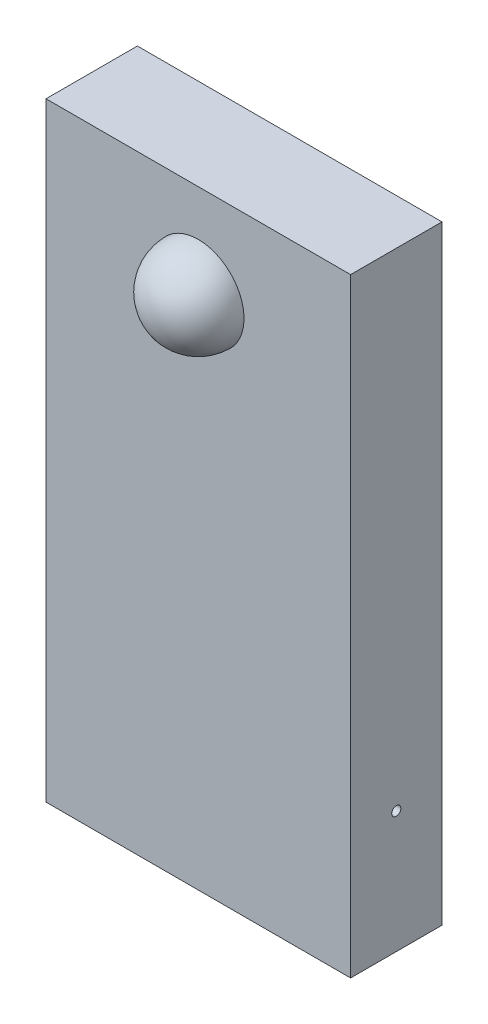
ISO-10303-21;
HEADER;
FILE_DESCRIPTION(('STEP AP214'),'2;1');
FILE_NAME('part.step','',(''),(''),'','','');
FILE_SCHEMA(('AUTOMOTIVE_DESIGN { 1 0 10303 214 1 1 1 1 }'));
ENDSEC;
DATA;
#1=APPLICATION_CONTEXT('core data for automotive mechanical design processes');
#2=APPLICATION_PROTOCOL_DEFINITION('international standard','automotive_design',2000,#1);
#3=PRODUCT_CONTEXT('',#1,'mechanical');
#4=PRODUCT('Part','Part','',(#3));
#5=PRODUCT_RELATED_PRODUCT_CATEGORY('part','',(#4));
#6=PRODUCT_DEFINITION_FORMATION('','',#4);
#7=PRODUCT_DEFINITION_CONTEXT('part definition',#1,'design');
#8=PRODUCT_DEFINITION('design','',#6,#7);
#9=PRODUCT_DEFINITION_SHAPE('','',#8);
#10=(LENGTH_UNIT() NAMED_UNIT(*) SI_UNIT(.MILLI.,.METRE.));
#11=(NAMED_UNIT(*) PLANE_ANGLE_UNIT() SI_UNIT($,.RADIAN.));
#12=(NAMED_UNIT(*) SI_UNIT($,.STERADIAN.) SOLID_ANGLE_UNIT());
#13=UNCERTAINTY_MEASURE_WITH_UNIT(LENGTH_MEASURE(1.E-05),#10,'distance_accuracy_value','');
#14=(GEOMETRIC_REPRESENTATION_CONTEXT(3) GLOBAL_UNCERTAINTY_ASSIGNED_CONTEXT((#13)) GLOBAL_UNIT_ASSIGNED_CONTEXT((#10,
#11,#12)) REPRESENTATION_CONTEXT('',''));
#15=CARTESIAN_POINT('',(0.,0.,0.));
#16=DIRECTION('',(0.,0.,1.));
#17=DIRECTION('',(1.,0.,0.));
#18=AXIS2_PLACEMENT_3D('',#15,#16,#17);
#19=CARTESIAN_POINT('',(50.,200.,15.));
#20=DIRECTION('',(-1.,0.,0.));
#21=DIRECTION('',(0.,0.,1.));
#22=AXIS2_PLACEMENT_3D('',#19,#20,#21);
#23=PLANE('',#22);
#24=CARTESIAN_POINT('',(50.,40.,0.));
#25=DIRECTION('',(-1.,0.,0.));
#26=DIRECTION('',(0.,0.,1.));
#27=AXIS2_PLACEMENT_3D('',#24,#25,#26);
#28=CIRCLE('',#27,1.5);
#29=CARTESIAN_POINT('',(50.,40.,1.5));
#30=VERTEX_POINT('',#29);
#31=EDGE_CURVE('E102',#30,#30,#28,.T.);
#32=ORIENTED_EDGE('',*,*,#31,.T.);
#33=EDGE_LOOP('',(#32));
#34=FACE_BOUND('',#33,.T.);
#35=DIRECTION('',(0.,0.,-1.));
#36=VECTOR('',#35,1.);
#37=CARTESIAN_POINT('',(50.,0.,15.));
#38=LINE('',#37,#36);
#39=CARTESIAN_POINT('',(50.,0.,15.));
#40=VERTEX_POINT('',#39);
#41=CARTESIAN_POINT('',(50.,0.,-15.));
#42=VERTEX_POINT('',#41);
#43=EDGE_CURVE('E99',#40,#42,#38,.T.);
#44=ORIENTED_EDGE('',*,*,#43,.T.);
#45=DIRECTION('',(0.,-1.,0.));
#46=VECTOR('',#45,1.);
#47=CARTESIAN_POINT('',(50.,200.,-15.));
#48=LINE('',#47,#46);
#49=CARTESIAN_POINT('',(50.,200.,-15.));
#50=VERTEX_POINT('',#49);
#51=EDGE_CURVE('E41',#50,#42,#48,.T.);
#52=ORIENTED_EDGE('',*,*,#51,.F.);
#53=DIRECTION('',(0.,0.,-1.));
#54=VECTOR('',#53,1.);
#55=CARTESIAN_POINT('',(50.,200.,15.));
#56=LINE('',#55,#54);
#57=CARTESIAN_POINT('',(50.,200.,15.));
#58=VERTEX_POINT('',#57);
#59=EDGE_CURVE('E85',#58,#50,#56,.T.);
#60=ORIENTED_EDGE('',*,*,#59,.F.);
#61=DIRECTION('',(0.,-1.,0.));
#62=VECTOR('',#61,1.);
#63=CARTESIAN_POINT('',(50.,200.,15.));
#64=LINE('',#63,#62);
#65=EDGE_CURVE('E95',#58,#40,#64,.T.);
#66=ORIENTED_EDGE('',*,*,#65,.T.);
#67=EDGE_LOOP('',(#44,#52,#60,#66));
#68=FACE_BOUND('',#67,.T.);
#69=ADVANCED_FACE('F33',(#34,#68),#23,.F.);
#70=CARTESIAN_POINT('',(-50.,200.,-15.));
#71=DIRECTION('',(0.,0.,1.));
#72=DIRECTION('',(1.,0.,0.));
#73=AXIS2_PLACEMENT_3D('',#70,#71,#72);
#74=PLANE('',#73);
#75=DIRECTION('',(-1.,0.,0.));
#76=VECTOR('',#75,1.);
#77=CARTESIAN_POINT('',(-50.,0.,-15.));
#78=LINE('',#77,#76);
#79=CARTESIAN_POINT('',(-50.,0.,-15.));
#80=VERTEX_POINT('',#79);
#81=EDGE_CURVE('E90',#42,#80,#78,.T.);
#82=ORIENTED_EDGE('',*,*,#81,.T.);
#83=DIRECTION('',(0.,-1.,0.));
#84=VECTOR('',#83,1.);
#85=CARTESIAN_POINT('',(-50.,200.,-15.));
#86=LINE('',#85,#84);
#87=CARTESIAN_POINT('',(-50.,200.,-15.));
#88=VERTEX_POINT('',#87);
#89=EDGE_CURVE('E88',#88,#80,#86,.T.);
#90=ORIENTED_EDGE('',*,*,#89,.F.);
#91=DIRECTION('',(-1.,0.,0.));
#92=VECTOR('',#91,1.);
#93=CARTESIAN_POINT('',(-50.,200.,-15.));
#94=LINE('',#93,#92);
#95=EDGE_CURVE('E80',#50,#88,#94,.T.);
#96=ORIENTED_EDGE('',*,*,#95,.F.);
#97=ORIENTED_EDGE('',*,*,#51,.T.);
#98=EDGE_LOOP('',(#82,#90,#96,#97));
#99=FACE_BOUND('',#98,.T.);
#100=ADVANCED_FACE('F89',(#99),#74,.F.);
#101=CARTESIAN_POINT('',(-50.,200.,15.));
#102=DIRECTION('',(1.,0.,0.));
#103=DIRECTION('',(0.,0.,-1.));
#104=AXIS2_PLACEMENT_3D('',#101,#102,#103);
#105=PLANE('',#104);
#106=CARTESIAN_POINT('',(-50.,40.,0.));
#107=DIRECTION('',(-1.,0.,0.));
#108=DIRECTION('',(0.,0.,1.));
#109=AXIS2_PLACEMENT_3D('',#106,#107,#108);
#110=CIRCLE('',#109,1.5);
#111=CARTESIAN_POINT('',(-50.,40.,1.5));
#112=VERTEX_POINT('',#111);
#113=EDGE_CURVE('E134',#112,#112,#110,.T.);
#114=ORIENTED_EDGE('',*,*,#113,.F.);
#115=EDGE_LOOP('',(#114));
#116=FACE_BOUND('',#115,.T.);
#117=DIRECTION('',(0.,0.,1.));
#118=VECTOR('',#117,1.);
#119=CARTESIAN_POINT('',(-50.,0.,15.));
#120=LINE('',#119,#118);
#121=CARTESIAN_POINT('',(-50.,0.,15.));
#122=VERTEX_POINT('',#121);
#123=EDGE_CURVE('E66',#80,#122,#120,.T.);
#124=ORIENTED_EDGE('',*,*,#123,.T.);
#125=DIRECTION('',(0.,-1.,0.));
#126=VECTOR('',#125,1.);
#127=CARTESIAN_POINT('',(-50.,200.,15.));
#128=LINE('',#127,#126);
#129=CARTESIAN_POINT('',(-50.,200.,15.));
#130=VERTEX_POINT('',#129);
#131=EDGE_CURVE('E91',#130,#122,#128,.T.);
#132=ORIENTED_EDGE('',*,*,#131,.F.);
#133=DIRECTION('',(0.,0.,1.));
#134=VECTOR('',#133,1.);
#135=CARTESIAN_POINT('',(-50.,200.,15.));
#136=LINE('',#135,#134);
#137=EDGE_CURVE('E83',#88,#130,#136,.T.);
#138=ORIENTED_EDGE('',*,*,#137,.F.);
#139=ORIENTED_EDGE('',*,*,#89,.T.);
#140=EDGE_LOOP('',(#124,#132,#138,#139));
#141=FACE_BOUND('',#140,.T.);
#142=ADVANCED_FACE('F93',(#116,#141),#105,.F.);
#143=CARTESIAN_POINT('',(-50.,200.,15.));
#144=DIRECTION('',(0.,0.,-1.));
#145=DIRECTION('',(-1.,0.,0.));
#146=AXIS2_PLACEMENT_3D('',#143,#144,#145);
#147=PLANE('',#146);
#148=CARTESIAN_POINT('',(0.,170.,15.));
#149=DIRECTION('',(0.,0.,-1.));
#150=DIRECTION('',(-1.,0.,0.));
#151=AXIS2_PLACEMENT_3D('',#148,#149,#150);
#152=CIRCLE('',#151,15.);
#153=CARTESIAN_POINT('',(-15.,170.,15.));
#154=VERTEX_POINT('',#153);
#155=EDGE_CURVE('E11',#154,#154,#152,.F.);
#156=ORIENTED_EDGE('',*,*,#155,.F.);
#157=EDGE_LOOP('',(#156));
#158=FACE_BOUND('',#157,.T.);
#159=DIRECTION('',(1.,0.,0.));
#160=VECTOR('',#159,1.);
#161=CARTESIAN_POINT('',(-50.,0.,15.));
#162=LINE('',#161,#160);
#163=EDGE_CURVE('E72',#122,#40,#162,.T.);
#164=ORIENTED_EDGE('',*,*,#163,.T.);
#165=ORIENTED_EDGE('',*,*,#65,.F.);
#166=DIRECTION('',(1.,0.,0.));
#167=VECTOR('',#166,1.);
#168=CARTESIAN_POINT('',(-50.,200.,15.));
#169=LINE('',#168,#167);
#170=EDGE_CURVE('E49',#130,#58,#169,.T.);
#171=ORIENTED_EDGE('',*,*,#170,.F.);
#172=ORIENTED_EDGE('',*,*,#131,.T.);
#173=EDGE_LOOP('',(#164,#165,#171,#172));
#174=FACE_BOUND('',#173,.T.);
#175=ADVANCED_FACE('F121',(#158,#174),#147,.F.);
#176=CARTESIAN_POINT('',(0.,200.,0.));
#177=DIRECTION('',(0.,-1.,0.));
#178=DIRECTION('',(0.,0.,-1.));
#179=AXIS2_PLACEMENT_3D('',#176,#177,#178);
#180=PLANE('',#179);
#181=ORIENTED_EDGE('',*,*,#59,.T.);
#182=ORIENTED_EDGE('',*,*,#95,.T.);
#183=ORIENTED_EDGE('',*,*,#137,.T.);
#184=ORIENTED_EDGE('',*,*,#170,.T.);
#185=EDGE_LOOP('',(#181,#182,#183,#184));
#186=FACE_BOUND('',#185,.T.);
#187=ADVANCED_FACE('F81',(#186),#180,.F.);
#188=CARTESIAN_POINT('',(0.,0.,0.));
#189=DIRECTION('',(0.,-1.,0.));
#190=DIRECTION('',(0.,0.,-1.));
#191=AXIS2_PLACEMENT_3D('',#188,#189,#190);
#192=PLANE('',#191);
#193=ORIENTED_EDGE('',*,*,#43,.F.);
#194=ORIENTED_EDGE('',*,*,#163,.F.);
#195=ORIENTED_EDGE('',*,*,#123,.F.);
#196=ORIENTED_EDGE('',*,*,#81,.F.);
#197=EDGE_LOOP('',(#193,#194,#195,#196));
#198=FACE_BOUND('',#197,.T.);
#199=ADVANCED_FACE('F110',(#198),#192,.T.);
#200=CARTESIAN_POINT('',(0.,170.,15.));
#201=DIRECTION('',(-1.,0.,0.));
#202=DIRECTION('',(0.,1.,0.));
#203=AXIS2_PLACEMENT_3D('',#200,#201,#202);
#204=SPHERICAL_SURFACE('',#203,15.);
#205=CARTESIAN_POINT('',(0.,170.,15.));
#206=DIRECTION('',(0.,0.,-1.));
#207=DIRECTION('',(-1.,0.,0.));
#208=AXIS2_PLACEMENT_3D('',#205,#206,#207);
#209=SPHERICAL_SURFACE('',#208,15.);
#210=ORIENTED_EDGE('',*,*,#155,.T.);
#211=EDGE_LOOP('',(#210));
#212=FACE_BOUND('',#211,.T.);
#213=ADVANCED_FACE('F112',(#212),#209,.T.);
#214=CARTESIAN_POINT('',(150.,40.,0.));
#215=DIRECTION('',(-1.,0.,0.));
#216=DIRECTION('',(0.,0.,1.));
#217=AXIS2_PLACEMENT_3D('',#214,#215,#216);
#218=CYLINDRICAL_SURFACE('',#217,1.5);
#219=ORIENTED_EDGE('',*,*,#113,.T.);
#220=EDGE_LOOP('',(#219));
#221=FACE_BOUND('',#220,.T.);
#222=ORIENTED_EDGE('',*,*,#31,.F.);
#223=EDGE_LOOP('',(#222));
#224=FACE_BOUND('',#223,.T.);
#225=ADVANCED_FACE('F118',(#221,#224),#218,.F.);
#226=CLOSED_SHELL('',(#69,#100,#142,#175,#187,#199,#213,#225));
#227=MANIFOLD_SOLID_BREP('B2',#226);
#228=ADVANCED_BREP_SHAPE_REPRESENTATION('',(#18,#227),#14);
#229=SHAPE_DEFINITION_REPRESENTATION(#9,#228);
ENDSEC;
END-ISO-10303-21;
